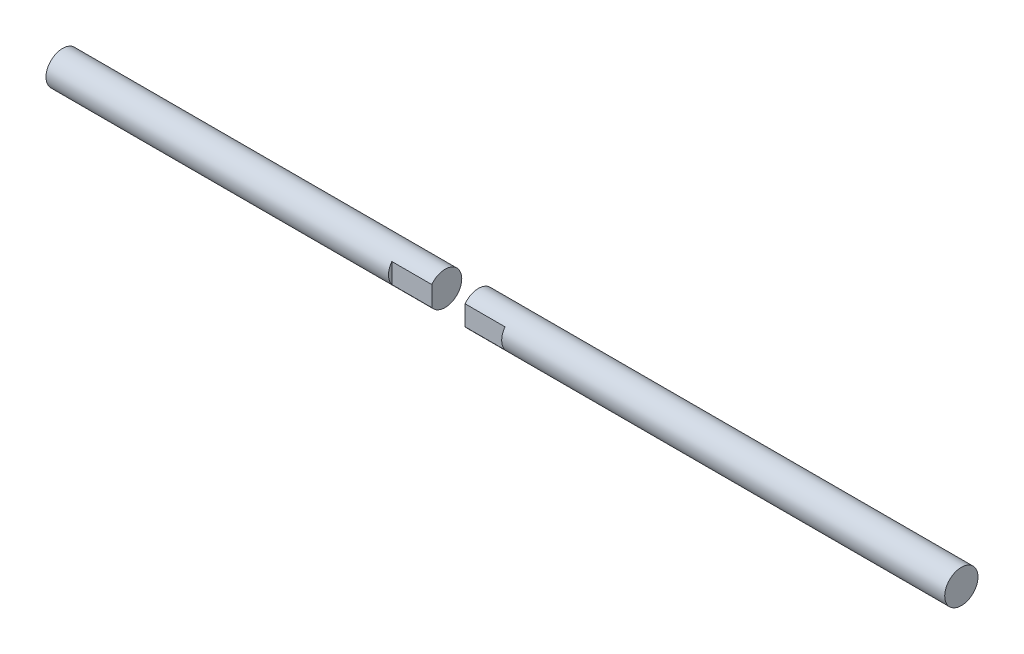
ISO-10303-21;
HEADER;
FILE_DESCRIPTION(('STEP AP214'),'2;1');
FILE_NAME('part.step','',(''),(''),'','','');
FILE_SCHEMA(('AUTOMOTIVE_DESIGN { 1 0 10303 214 1 1 1 1 }'));
ENDSEC;
DATA;
#1=APPLICATION_CONTEXT('core data for automotive mechanical design processes');
#2=APPLICATION_PROTOCOL_DEFINITION('international standard','automotive_design',2000,#1);
#3=PRODUCT_CONTEXT('',#1,'mechanical');
#4=PRODUCT('Part','Part','',(#3));
#5=PRODUCT_RELATED_PRODUCT_CATEGORY('part','',(#4));
#6=PRODUCT_DEFINITION_FORMATION('','',#4);
#7=PRODUCT_DEFINITION_CONTEXT('part definition',#1,'design');
#8=PRODUCT_DEFINITION('design','',#6,#7);
#9=PRODUCT_DEFINITION_SHAPE('','',#8);
#10=(LENGTH_UNIT() NAMED_UNIT(*) SI_UNIT(.MILLI.,.METRE.));
#11=(NAMED_UNIT(*) PLANE_ANGLE_UNIT() SI_UNIT($,.RADIAN.));
#12=(NAMED_UNIT(*) SI_UNIT($,.STERADIAN.) SOLID_ANGLE_UNIT());
#13=UNCERTAINTY_MEASURE_WITH_UNIT(LENGTH_MEASURE(1.E-05),#10,'distance_accuracy_value','');
#14=(GEOMETRIC_REPRESENTATION_CONTEXT(3) GLOBAL_UNCERTAINTY_ASSIGNED_CONTEXT((#13)) GLOBAL_UNIT_ASSIGNED_CONTEXT((#10,
#11,#12)) REPRESENTATION_CONTEXT('',''));
#15=CARTESIAN_POINT('',(0.,0.,0.));
#16=DIRECTION('',(0.,0.,1.));
#17=DIRECTION('',(1.,0.,0.));
#18=AXIS2_PLACEMENT_3D('',#15,#16,#17);
#19=CARTESIAN_POINT('',(165.1,0.,0.));
#20=DIRECTION('',(-1.,0.,0.));
#21=DIRECTION('',(0.,0.,1.));
#22=AXIS2_PLACEMENT_3D('',#19,#20,#21);
#23=CYLINDRICAL_SURFACE('',#22,3.175);
#24=CARTESIAN_POINT('',(0.,0.,0.));
#25=DIRECTION('',(1.,0.,0.));
#26=DIRECTION('',(0.,0.,-1.));
#27=AXIS2_PLACEMENT_3D('',#24,#25,#26);
#28=CIRCLE('',#27,3.175);
#29=CARTESIAN_POINT('',(0.,0.,-3.175));
#30=VERTEX_POINT('',#29);
#31=EDGE_CURVE('E72',#30,#30,#28,.T.);
#32=ORIENTED_EDGE('',*,*,#31,.T.);
#33=EDGE_LOOP('',(#32));
#34=FACE_BOUND('',#33,.T.);
#35=DIRECTION('',(-1.,0.,0.));
#36=VECTOR('',#35,1.);
#37=CARTESIAN_POINT('',(165.1,1.905,2.54));
#38=LINE('',#37,#36);
#39=CARTESIAN_POINT('',(72.9649787178467,1.905,2.54));
#40=VERTEX_POINT('',#39);
#41=CARTESIAN_POINT('',(65.3449787178467,1.905,2.54));
#42=VERTEX_POINT('',#41);
#43=EDGE_CURVE('E64',#40,#42,#38,.T.);
#44=ORIENTED_EDGE('',*,*,#43,.F.);
#45=CARTESIAN_POINT('',(72.9649787178467,0.,0.));
#46=DIRECTION('',(-1.,0.,0.));
#47=DIRECTION('',(0.,0.,1.));
#48=AXIS2_PLACEMENT_3D('',#45,#46,#47);
#49=CIRCLE('',#48,3.175);
#50=CARTESIAN_POINT('',(72.9649787178467,-1.905,2.54));
#51=VERTEX_POINT('',#50);
#52=EDGE_CURVE('E77',#40,#51,#49,.T.);
#53=ORIENTED_EDGE('',*,*,#52,.T.);
#54=DIRECTION('',(-1.,0.,0.));
#55=VECTOR('',#54,1.);
#56=CARTESIAN_POINT('',(165.1,-1.905,2.54));
#57=LINE('',#56,#55);
#58=CARTESIAN_POINT('',(65.3449787178467,-1.905,2.54));
#59=VERTEX_POINT('',#58);
#60=EDGE_CURVE('E56',#59,#51,#57,.F.);
#61=ORIENTED_EDGE('',*,*,#60,.F.);
#62=CARTESIAN_POINT('',(65.3449787178467,0.,0.));
#63=DIRECTION('',(1.,0.,0.));
#64=DIRECTION('',(0.,0.,-1.));
#65=AXIS2_PLACEMENT_3D('',#62,#63,#64);
#66=CIRCLE('',#65,3.175);
#67=EDGE_CURVE('E12',#42,#59,#66,.T.);
#68=ORIENTED_EDGE('',*,*,#67,.F.);
#69=EDGE_LOOP('',(#44,#53,#61,#68));
#70=FACE_BOUND('',#69,.T.);
#71=ADVANCED_FACE('F42',(#34,#70),#23,.T.);
#72=CARTESIAN_POINT('',(72.9649787178467,7.79509465437656,-3.175));
#73=DIRECTION('',(-1.,0.,0.));
#74=DIRECTION('',(0.,0.,1.));
#75=AXIS2_PLACEMENT_3D('',#72,#73,#74);
#76=PLANE('',#75);
#77=DIRECTION('',(0.,1.,0.));
#78=VECTOR('',#77,1.);
#79=CARTESIAN_POINT('',(72.9649787178467,7.79509465437656,2.54));
#80=LINE('',#79,#78);
#81=EDGE_CURVE('E49',#51,#40,#80,.T.);
#82=ORIENTED_EDGE('',*,*,#81,.F.);
#83=ORIENTED_EDGE('',*,*,#52,.F.);
#84=EDGE_LOOP('',(#82,#83));
#85=FACE_BOUND('',#84,.T.);
#86=ADVANCED_FACE('F87',(#85),#76,.F.);
#87=CARTESIAN_POINT('',(0.,0.,0.));
#88=DIRECTION('',(1.,0.,0.));
#89=DIRECTION('',(0.,0.,-1.));
#90=AXIS2_PLACEMENT_3D('',#87,#88,#89);
#91=PLANE('',#90);
#92=ORIENTED_EDGE('',*,*,#31,.F.);
#93=EDGE_LOOP('',(#92));
#94=FACE_BOUND('',#93,.T.);
#95=ADVANCED_FACE('F85',(#94),#91,.F.);
#96=CARTESIAN_POINT('',(65.3449787178467,5.82887048834445,15.494));
#97=DIRECTION('',(1.,0.,0.));
#98=DIRECTION('',(0.,0.,-1.));
#99=AXIS2_PLACEMENT_3D('',#96,#97,#98);
#100=PLANE('',#99);
#101=ORIENTED_EDGE('',*,*,#67,.T.);
#102=DIRECTION('',(0.,-1.,0.));
#103=VECTOR('',#102,1.);
#104=CARTESIAN_POINT('',(65.3449787178467,5.82887048834445,2.54));
#105=LINE('',#104,#103);
#106=EDGE_CURVE('E67',#42,#59,#105,.T.);
#107=ORIENTED_EDGE('',*,*,#106,.F.);
#108=EDGE_LOOP('',(#101,#107));
#109=FACE_BOUND('',#108,.T.);
#110=ADVANCED_FACE('F75',(#109),#100,.T.);
#111=CARTESIAN_POINT('',(65.3449787178467,-5.05095795669352,2.54));
#112=DIRECTION('',(0.,0.,1.));
#113=DIRECTION('',(1.,0.,0.));
#114=AXIS2_PLACEMENT_3D('',#111,#112,#113);
#115=PLANE('',#114);
#116=ORIENTED_EDGE('',*,*,#43,.T.);
#117=ORIENTED_EDGE('',*,*,#106,.T.);
#118=ORIENTED_EDGE('',*,*,#60,.T.);
#119=ORIENTED_EDGE('',*,*,#81,.T.);
#120=EDGE_LOOP('',(#116,#117,#118,#119));
#121=FACE_BOUND('',#120,.T.);
#122=ADVANCED_FACE('F66',(#121),#115,.T.);
#123=CLOSED_SHELL('',(#71,#86,#95,#110,#122));
#124=MANIFOLD_SOLID_BREP('B2',#123);
#125=CARTESIAN_POINT('',(165.1,0.,0.));
#126=DIRECTION('',(-1.,0.,0.));
#127=DIRECTION('',(0.,0.,1.));
#128=AXIS2_PLACEMENT_3D('',#125,#126,#127);
#129=CYLINDRICAL_SURFACE('',#128,3.175);
#130=DIRECTION('',(-1.,0.,0.));
#131=VECTOR('',#130,1.);
#132=CARTESIAN_POINT('',(165.1,1.905,2.54));
#133=LINE('',#132,#131);
#134=CARTESIAN_POINT('',(86.9349787178467,1.905,2.54));
#135=VERTEX_POINT('',#134);
#136=CARTESIAN_POINT('',(79.3149787178467,1.905,2.54));
#137=VERTEX_POINT('',#136);
#138=EDGE_CURVE('E142',#135,#137,#133,.T.);
#139=ORIENTED_EDGE('',*,*,#138,.F.);
#140=CARTESIAN_POINT('',(86.9349787178467,0.,0.));
#141=DIRECTION('',(-1.,0.,0.));
#142=DIRECTION('',(0.,0.,1.));
#143=AXIS2_PLACEMENT_3D('',#140,#141,#142);
#144=CIRCLE('',#143,3.175);
#145=CARTESIAN_POINT('',(86.9349787178467,-1.905,2.54));
#146=VERTEX_POINT('',#145);
#147=EDGE_CURVE('E40',#146,#135,#144,.T.);
#148=ORIENTED_EDGE('',*,*,#147,.F.);
#149=DIRECTION('',(-1.,0.,0.));
#150=VECTOR('',#149,1.);
#151=CARTESIAN_POINT('',(165.1,-1.905,2.54));
#152=LINE('',#151,#150);
#153=CARTESIAN_POINT('',(79.3149787178467,-1.905,2.54));
#154=VERTEX_POINT('',#153);
#155=EDGE_CURVE('E150',#154,#146,#152,.F.);
#156=ORIENTED_EDGE('',*,*,#155,.F.);
#157=CARTESIAN_POINT('',(79.3149787178467,0.,0.));
#158=DIRECTION('',(1.,0.,0.));
#159=DIRECTION('',(0.,0.,-1.));
#160=AXIS2_PLACEMENT_3D('',#157,#158,#159);
#161=CIRCLE('',#160,3.175);
#162=EDGE_CURVE('E164',#154,#137,#161,.T.);
#163=ORIENTED_EDGE('',*,*,#162,.T.);
#164=EDGE_LOOP('',(#139,#148,#156,#163));
#165=FACE_BOUND('',#164,.T.);
#166=CARTESIAN_POINT('',(171.45,0.,0.));
#167=DIRECTION('',(1.,0.,0.));
#168=DIRECTION('',(0.,0.,-1.));
#169=AXIS2_PLACEMENT_3D('',#166,#167,#168);
#170=CIRCLE('',#169,3.175);
#171=CARTESIAN_POINT('',(171.45,0.,-3.175));
#172=VERTEX_POINT('',#171);
#173=EDGE_CURVE('E161',#172,#172,#170,.T.);
#174=ORIENTED_EDGE('',*,*,#173,.F.);
#175=EDGE_LOOP('',(#174));
#176=FACE_BOUND('',#175,.T.);
#177=ADVANCED_FACE('F128',(#165,#176),#129,.T.);
#178=CARTESIAN_POINT('',(79.3149787178467,7.79509465437656,-3.175));
#179=DIRECTION('',(1.,0.,0.));
#180=DIRECTION('',(0.,0.,-1.));
#181=AXIS2_PLACEMENT_3D('',#178,#179,#180);
#182=PLANE('',#181);
#183=DIRECTION('',(0.,-1.,0.));
#184=VECTOR('',#183,1.);
#185=CARTESIAN_POINT('',(79.3149787178467,7.79509465437656,2.54));
#186=LINE('',#185,#184);
#187=EDGE_CURVE('E135',#137,#154,#186,.T.);
#188=ORIENTED_EDGE('',*,*,#187,.F.);
#189=ORIENTED_EDGE('',*,*,#162,.F.);
#190=EDGE_LOOP('',(#188,#189));
#191=FACE_BOUND('',#190,.T.);
#192=ADVANCED_FACE('F173',(#191),#182,.F.);
#193=CARTESIAN_POINT('',(86.9349787178467,5.82887048834445,15.494));
#194=DIRECTION('',(-1.,0.,0.));
#195=DIRECTION('',(0.,0.,1.));
#196=AXIS2_PLACEMENT_3D('',#193,#194,#195);
#197=PLANE('',#196);
#198=ORIENTED_EDGE('',*,*,#147,.T.);
#199=DIRECTION('',(0.,1.,0.));
#200=VECTOR('',#199,1.);
#201=CARTESIAN_POINT('',(86.9349787178467,5.82887048834445,2.54));
#202=LINE('',#201,#200);
#203=EDGE_CURVE('E153',#146,#135,#202,.T.);
#204=ORIENTED_EDGE('',*,*,#203,.F.);
#205=EDGE_LOOP('',(#198,#204));
#206=FACE_BOUND('',#205,.T.);
#207=ADVANCED_FACE('F160',(#206),#197,.T.);
#208=CARTESIAN_POINT('',(65.3449787178467,-5.05095795669352,2.54));
#209=DIRECTION('',(0.,0.,1.));
#210=DIRECTION('',(1.,0.,0.));
#211=AXIS2_PLACEMENT_3D('',#208,#209,#210);
#212=PLANE('',#211);
#213=ORIENTED_EDGE('',*,*,#138,.T.);
#214=ORIENTED_EDGE('',*,*,#187,.T.);
#215=ORIENTED_EDGE('',*,*,#155,.T.);
#216=ORIENTED_EDGE('',*,*,#203,.T.);
#217=EDGE_LOOP('',(#213,#214,#215,#216));
#218=FACE_BOUND('',#217,.T.);
#219=ADVANCED_FACE('F152',(#218),#212,.T.);
#220=CARTESIAN_POINT('',(171.45,0.,0.));
#221=DIRECTION('',(1.,0.,0.));
#222=DIRECTION('',(0.,0.,-1.));
#223=AXIS2_PLACEMENT_3D('',#220,#221,#222);
#224=PLANE('',#223);
#225=ORIENTED_EDGE('',*,*,#173,.T.);
#226=EDGE_LOOP('',(#225));
#227=FACE_BOUND('',#226,.T.);
#228=ADVANCED_FACE('F171',(#227),#224,.T.);
#229=CLOSED_SHELL('',(#177,#192,#207,#219,#228));
#230=MANIFOLD_SOLID_BREP('B6',#229);
#231=ADVANCED_BREP_SHAPE_REPRESENTATION('',(#18,#124,#230),#14);
#232=SHAPE_DEFINITION_REPRESENTATION(#9,#231);
ENDSEC;
END-ISO-10303-21;
